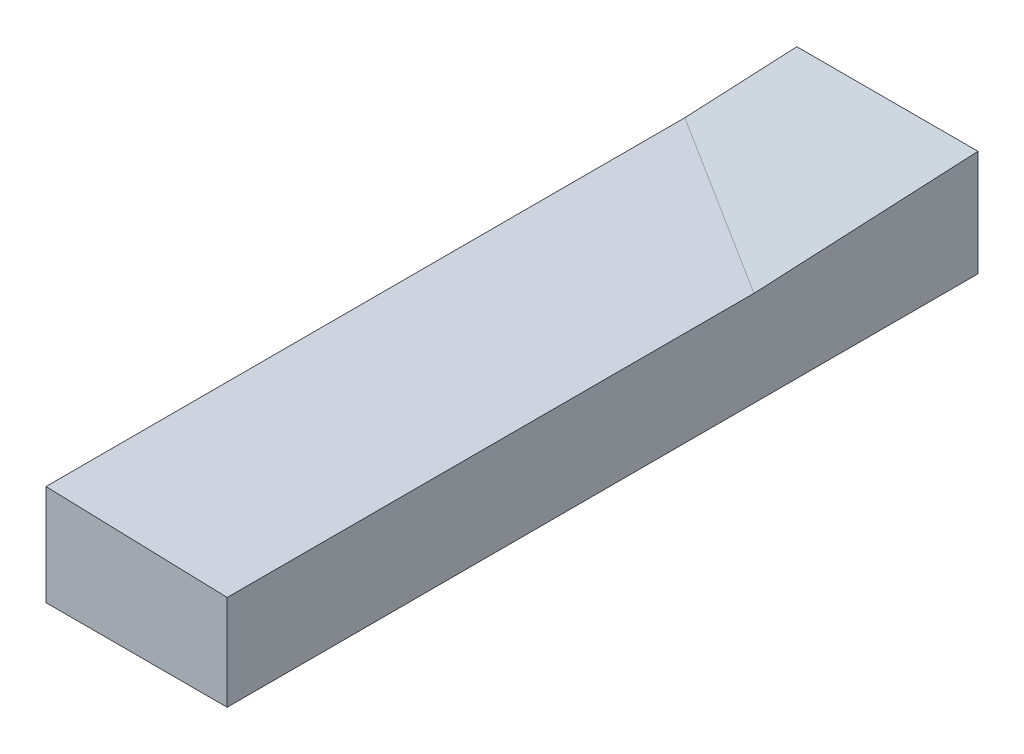
ISO-10303-21;
HEADER;
FILE_DESCRIPTION(('STEP AP214'),'2;1');
FILE_NAME('part.step','',(''),(''),'','','');
FILE_SCHEMA(('AUTOMOTIVE_DESIGN { 1 0 10303 214 1 1 1 1 }'));
ENDSEC;
DATA;
#1=APPLICATION_CONTEXT('core data for automotive mechanical design processes');
#2=APPLICATION_PROTOCOL_DEFINITION('international standard','automotive_design',2000,#1);
#3=PRODUCT_CONTEXT('',#1,'mechanical');
#4=PRODUCT('Part','Part','',(#3));
#5=PRODUCT_RELATED_PRODUCT_CATEGORY('part','',(#4));
#6=PRODUCT_DEFINITION_FORMATION('','',#4);
#7=PRODUCT_DEFINITION_CONTEXT('part definition',#1,'design');
#8=PRODUCT_DEFINITION('design','',#6,#7);
#9=PRODUCT_DEFINITION_SHAPE('','',#8);
#10=(LENGTH_UNIT() NAMED_UNIT(*) SI_UNIT(.MILLI.,.METRE.));
#11=(NAMED_UNIT(*) PLANE_ANGLE_UNIT() SI_UNIT($,.RADIAN.));
#12=(NAMED_UNIT(*) SI_UNIT($,.STERADIAN.) SOLID_ANGLE_UNIT());
#13=UNCERTAINTY_MEASURE_WITH_UNIT(LENGTH_MEASURE(1.E-05),#10,'distance_accuracy_value','');
#14=(GEOMETRIC_REPRESENTATION_CONTEXT(3) GLOBAL_UNCERTAINTY_ASSIGNED_CONTEXT((#13)) GLOBAL_UNIT_ASSIGNED_CONTEXT((#10,
#11,#12)) REPRESENTATION_CONTEXT('',''));
#15=CARTESIAN_POINT('',(0.,0.,0.));
#16=DIRECTION('',(0.,0.,1.));
#17=DIRECTION('',(1.,0.,0.));
#18=AXIS2_PLACEMENT_3D('',#15,#16,#17);
#19=CARTESIAN_POINT('',(-137.16,0.,0.));
#20=DIRECTION('',(-1.,0.,0.));
#21=DIRECTION('',(0.,0.,1.));
#22=AXIS2_PLACEMENT_3D('',#19,#20,#21);
#23=PLANE('',#22);
#24=DIRECTION('',(0.,-0.0489608186254638,0.998800699959469));
#25=VECTOR('',#24,1.);
#26=CARTESIAN_POINT('',(-137.16,82.55,-584.2));
#27=LINE('',#26,#25);
#28=CARTESIAN_POINT('',(-137.16,82.55,-584.2));
#29=VERTEX_POINT('',#28);
#30=CARTESIAN_POINT('',(-137.16,74.0063636363637,-409.909818181818));
#31=VERTEX_POINT('',#30);
#32=EDGE_CURVE('E45',#29,#31,#27,.T.);
#33=ORIENTED_EDGE('',*,*,#32,.T.);
#34=DIRECTION('',(0.,0.,1.));
#35=VECTOR('',#34,1.);
#36=CARTESIAN_POINT('',(-137.16,74.0063636363637,-584.2));
#37=LINE('',#36,#35);
#38=CARTESIAN_POINT('',(-137.16,74.0063636363637,0.));
#39=VERTEX_POINT('',#38);
#40=EDGE_CURVE('E134',#31,#39,#37,.T.);
#41=ORIENTED_EDGE('',*,*,#40,.T.);
#42=DIRECTION('',(0.,1.,0.));
#43=VECTOR('',#42,1.);
#44=CARTESIAN_POINT('',(-137.16,0.,0.));
#45=LINE('',#44,#43);
#46=CARTESIAN_POINT('',(-137.16,0.,0.));
#47=VERTEX_POINT('',#46);
#48=EDGE_CURVE('E95',#47,#39,#45,.T.);
#49=ORIENTED_EDGE('',*,*,#48,.F.);
#50=DIRECTION('',(0.,0.,-1.));
#51=VECTOR('',#50,1.);
#52=CARTESIAN_POINT('',(-137.16,0.,-584.2));
#53=LINE('',#52,#51);
#54=CARTESIAN_POINT('',(-137.16,0.,-584.2));
#55=VERTEX_POINT('',#54);
#56=EDGE_CURVE('E51',#47,#55,#53,.T.);
#57=ORIENTED_EDGE('',*,*,#56,.T.);
#58=DIRECTION('',(0.,1.,0.));
#59=VECTOR('',#58,1.);
#60=CARTESIAN_POINT('',(-137.16,0.,-584.2));
#61=LINE('',#60,#59);
#62=EDGE_CURVE('E11',#55,#29,#61,.T.);
#63=ORIENTED_EDGE('',*,*,#62,.T.);
#64=EDGE_LOOP('',(#33,#41,#49,#57,#63));
#65=FACE_BOUND('',#64,.T.);
#66=ADVANCED_FACE('F42',(#65),#23,.F.);
#67=CARTESIAN_POINT('',(-943.794471192522,82.55,-584.2));
#68=DIRECTION('',(0.,0.998800699959469,0.0489608186254638));
#69=DIRECTION('',(0.,-0.0489608186254638,0.998800699959469));
#70=AXIS2_PLACEMENT_3D('',#67,#68,#69);
#71=PLANE('',#70);
#72=ORIENTED_EDGE('',*,*,#32,.F.);
#73=DIRECTION('',(1.,0.,0.));
#74=VECTOR('',#73,1.);
#75=CARTESIAN_POINT('',(-943.794471192522,82.55,-584.2));
#76=LINE('',#75,#74);
#77=CARTESIAN_POINT('',(-278.13,82.55,-584.2));
#78=VERTEX_POINT('',#77);
#79=EDGE_CURVE('E129',#78,#29,#76,.T.);
#80=ORIENTED_EDGE('',*,*,#79,.F.);
#81=DIRECTION('',(0.,-0.0489608186254638,0.998800699959469));
#82=VECTOR('',#81,1.);
#83=CARTESIAN_POINT('',(-278.13,82.55,-584.2));
#84=LINE('',#83,#82);
#85=CARTESIAN_POINT('',(-278.13,78.2781818181818,-497.054909090909));
#86=VERTEX_POINT('',#85);
#87=EDGE_CURVE('E110',#78,#86,#84,.T.);
#88=ORIENTED_EDGE('',*,*,#87,.T.);
#89=DIRECTION('',(0.850312150745116,-0.025767034871064,0.525647511369709));
#90=VECTOR('',#89,1.);
#91=CARTESIAN_POINT('',(-419.1,82.55,-584.2));
#92=LINE('',#91,#90);
#93=EDGE_CURVE('E99',#86,#31,#92,.T.);
#94=ORIENTED_EDGE('',*,*,#93,.T.);
#95=EDGE_LOOP('',(#72,#80,#88,#94));
#96=FACE_BOUND('',#95,.T.);
#97=ADVANCED_FACE('F141',(#96),#71,.T.);
#98=CARTESIAN_POINT('',(-419.1,82.55,-584.2));
#99=DIRECTION('',(0.0302891266407689,0.999541179145381,0.));
#100=DIRECTION('',(-0.999541179145382,0.030289126640769,0.));
#101=AXIS2_PLACEMENT_3D('',#98,#99,#100);
#102=PLANE('',#101);
#103=ORIENTED_EDGE('',*,*,#40,.F.);
#104=ORIENTED_EDGE('',*,*,#93,.F.);
#105=DIRECTION('',(0.,0.,1.));
#106=VECTOR('',#105,1.);
#107=CARTESIAN_POINT('',(-278.13,78.2781818181818,-584.2));
#108=LINE('',#107,#106);
#109=CARTESIAN_POINT('',(-278.13,78.2781818181818,0.));
#110=VERTEX_POINT('',#109);
#111=EDGE_CURVE('E104',#86,#110,#108,.T.);
#112=ORIENTED_EDGE('',*,*,#111,.T.);
#113=DIRECTION('',(-0.999541179145381,0.030289126640769,0.));
#114=VECTOR('',#113,1.);
#115=CARTESIAN_POINT('',(-419.1,82.55,0.));
#116=LINE('',#115,#114);
#117=EDGE_CURVE('E88',#39,#110,#116,.T.);
#118=ORIENTED_EDGE('',*,*,#117,.F.);
#119=EDGE_LOOP('',(#103,#104,#112,#118));
#120=FACE_BOUND('',#119,.T.);
#121=ADVANCED_FACE('F105',(#120),#102,.T.);
#122=CARTESIAN_POINT('',(-419.1,0.,-584.2));
#123=DIRECTION('',(0.,-1.,0.));
#124=DIRECTION('',(0.,0.,-1.));
#125=AXIS2_PLACEMENT_3D('',#122,#123,#124);
#126=PLANE('',#125);
#127=ORIENTED_EDGE('',*,*,#56,.F.);
#128=DIRECTION('',(1.,0.,0.));
#129=VECTOR('',#128,1.);
#130=CARTESIAN_POINT('',(-419.1,0.,0.));
#131=LINE('',#130,#129);
#132=CARTESIAN_POINT('',(-278.13,0.,0.));
#133=VERTEX_POINT('',#132);
#134=EDGE_CURVE('E100',#133,#47,#131,.T.);
#135=ORIENTED_EDGE('',*,*,#134,.F.);
#136=DIRECTION('',(0.,0.,-1.));
#137=VECTOR('',#136,1.);
#138=CARTESIAN_POINT('',(-278.13,0.,-584.2));
#139=LINE('',#138,#137);
#140=CARTESIAN_POINT('',(-278.13,0.,-584.2));
#141=VERTEX_POINT('',#140);
#142=EDGE_CURVE('E115',#133,#141,#139,.T.);
#143=ORIENTED_EDGE('',*,*,#142,.T.);
#144=DIRECTION('',(1.,0.,0.));
#145=VECTOR('',#144,1.);
#146=CARTESIAN_POINT('',(-419.1,0.,-584.2));
#147=LINE('',#146,#145);
#148=EDGE_CURVE('E120',#141,#55,#147,.T.);
#149=ORIENTED_EDGE('',*,*,#148,.T.);
#150=EDGE_LOOP('',(#127,#135,#143,#149));
#151=FACE_BOUND('',#150,.T.);
#152=ADVANCED_FACE('F149',(#151),#126,.T.);
#153=CARTESIAN_POINT('',(0.,0.,0.));
#154=DIRECTION('',(0.,0.,-1.));
#155=DIRECTION('',(-1.,0.,0.));
#156=AXIS2_PLACEMENT_3D('',#153,#154,#155);
#157=PLANE('',#156);
#158=ORIENTED_EDGE('',*,*,#134,.T.);
#159=ORIENTED_EDGE('',*,*,#48,.T.);
#160=ORIENTED_EDGE('',*,*,#117,.T.);
#161=DIRECTION('',(0.,1.,0.));
#162=VECTOR('',#161,1.);
#163=CARTESIAN_POINT('',(-278.13,0.,0.));
#164=LINE('',#163,#162);
#165=EDGE_CURVE('E93',#133,#110,#164,.T.);
#166=ORIENTED_EDGE('',*,*,#165,.F.);
#167=EDGE_LOOP('',(#158,#159,#160,#166));
#168=FACE_BOUND('',#167,.T.);
#169=ADVANCED_FACE('F91',(#168),#157,.F.);
#170=CARTESIAN_POINT('',(0.,0.,-584.2));
#171=DIRECTION('',(0.,0.,-1.));
#172=DIRECTION('',(-1.,0.,0.));
#173=AXIS2_PLACEMENT_3D('',#170,#171,#172);
#174=PLANE('',#173);
#175=ORIENTED_EDGE('',*,*,#62,.F.);
#176=ORIENTED_EDGE('',*,*,#148,.F.);
#177=DIRECTION('',(0.,1.,0.));
#178=VECTOR('',#177,1.);
#179=CARTESIAN_POINT('',(-278.13,0.,-584.2));
#180=LINE('',#179,#178);
#181=EDGE_CURVE('E124',#141,#78,#180,.T.);
#182=ORIENTED_EDGE('',*,*,#181,.T.);
#183=ORIENTED_EDGE('',*,*,#79,.T.);
#184=EDGE_LOOP('',(#175,#176,#182,#183));
#185=FACE_BOUND('',#184,.T.);
#186=ADVANCED_FACE('F147',(#185),#174,.T.);
#187=CARTESIAN_POINT('',(-278.13,0.,0.));
#188=DIRECTION('',(-1.,0.,0.));
#189=DIRECTION('',(0.,0.,1.));
#190=AXIS2_PLACEMENT_3D('',#187,#188,#189);
#191=PLANE('',#190);
#192=ORIENTED_EDGE('',*,*,#87,.F.);
#193=ORIENTED_EDGE('',*,*,#181,.F.);
#194=ORIENTED_EDGE('',*,*,#142,.F.);
#195=ORIENTED_EDGE('',*,*,#165,.T.);
#196=ORIENTED_EDGE('',*,*,#111,.F.);
#197=EDGE_LOOP('',(#192,#193,#194,#195,#196));
#198=FACE_BOUND('',#197,.T.);
#199=ADVANCED_FACE('F113',(#198),#191,.T.);
#200=CLOSED_SHELL('',(#66,#97,#121,#152,#169,#186,#199));
#201=MANIFOLD_SOLID_BREP('B2',#200);
#202=ADVANCED_BREP_SHAPE_REPRESENTATION('',(#18,#201),#14);
#203=SHAPE_DEFINITION_REPRESENTATION(#9,#202);
ENDSEC;
END-ISO-10303-21;
